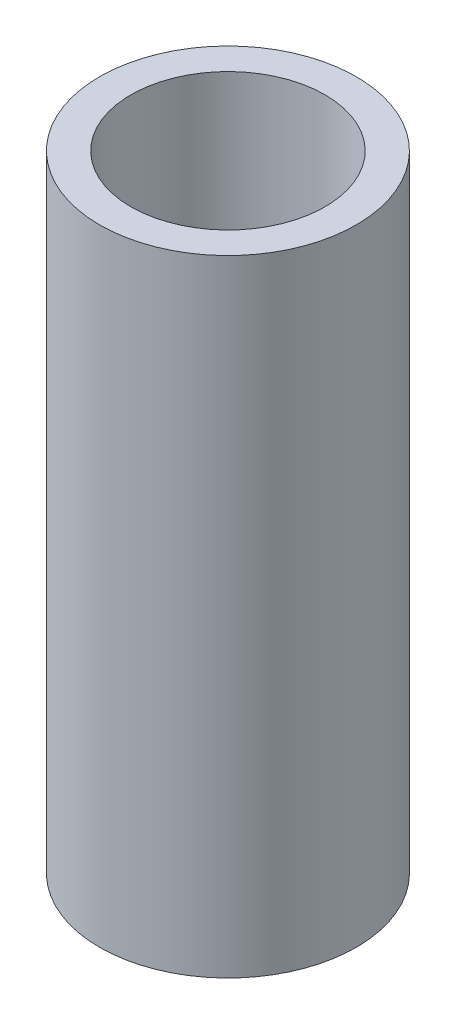
ISO-10303-21;
HEADER;
FILE_DESCRIPTION(('STEP AP214'),'2;1');
FILE_NAME('part.step','',(''),(''),'','','');
FILE_SCHEMA(('AUTOMOTIVE_DESIGN { 1 0 10303 214 1 1 1 1 }'));
ENDSEC;
DATA;
#1=APPLICATION_CONTEXT('core data for automotive mechanical design processes');
#2=APPLICATION_PROTOCOL_DEFINITION('international standard','automotive_design',2000,#1);
#3=PRODUCT_CONTEXT('',#1,'mechanical');
#4=PRODUCT('Part','Part','',(#3));
#5=PRODUCT_RELATED_PRODUCT_CATEGORY('part','',(#4));
#6=PRODUCT_DEFINITION_FORMATION('','',#4);
#7=PRODUCT_DEFINITION_CONTEXT('part definition',#1,'design');
#8=PRODUCT_DEFINITION('design','',#6,#7);
#9=PRODUCT_DEFINITION_SHAPE('','',#8);
#10=(LENGTH_UNIT() NAMED_UNIT(*) SI_UNIT(.MILLI.,.METRE.));
#11=(NAMED_UNIT(*) PLANE_ANGLE_UNIT() SI_UNIT($,.RADIAN.));
#12=(NAMED_UNIT(*) SI_UNIT($,.STERADIAN.) SOLID_ANGLE_UNIT());
#13=UNCERTAINTY_MEASURE_WITH_UNIT(LENGTH_MEASURE(1.E-05),#10,'distance_accuracy_value','');
#14=(GEOMETRIC_REPRESENTATION_CONTEXT(3) GLOBAL_UNCERTAINTY_ASSIGNED_CONTEXT((#13)) GLOBAL_UNIT_ASSIGNED_CONTEXT((#10,
#11,#12)) REPRESENTATION_CONTEXT('',''));
#15=CARTESIAN_POINT('',(0.,0.,0.));
#16=DIRECTION('',(0.,0.,1.));
#17=DIRECTION('',(1.,0.,0.));
#18=AXIS2_PLACEMENT_3D('',#15,#16,#17);
#19=CARTESIAN_POINT('',(0.,19.5,0.));
#20=DIRECTION('',(0.,1.,0.));
#21=DIRECTION('',(0.,0.,1.));
#22=AXIS2_PLACEMENT_3D('',#19,#20,#21);
#23=PLANE('',#22);
#24=CARTESIAN_POINT('',(0.,19.5,0.));
#25=DIRECTION('',(0.,1.,0.));
#26=DIRECTION('',(0.,0.,1.));
#27=AXIS2_PLACEMENT_3D('',#24,#25,#26);
#28=CIRCLE('',#27,4.);
#29=CARTESIAN_POINT('',(0.,19.5,4.));
#30=VERTEX_POINT('',#29);
#31=EDGE_CURVE('E10',#30,#30,#28,.T.);
#32=ORIENTED_EDGE('',*,*,#31,.T.);
#33=EDGE_LOOP('',(#32));
#34=FACE_BOUND('',#33,.T.);
#35=CARTESIAN_POINT('',(0.,19.5,0.));
#36=DIRECTION('',(0.,1.,0.));
#37=DIRECTION('',(0.,0.,1.));
#38=AXIS2_PLACEMENT_3D('',#35,#36,#37);
#39=CIRCLE('',#38,3.025);
#40=CARTESIAN_POINT('',(0.,19.5,3.025));
#41=VERTEX_POINT('',#40);
#42=EDGE_CURVE('E42',#41,#41,#39,.T.);
#43=ORIENTED_EDGE('',*,*,#42,.F.);
#44=EDGE_LOOP('',(#43));
#45=FACE_BOUND('',#44,.T.);
#46=ADVANCED_FACE('F31',(#34,#45),#23,.T.);
#47=CARTESIAN_POINT('',(0.,0.,0.));
#48=DIRECTION('',(0.,1.,0.));
#49=DIRECTION('',(0.,0.,1.));
#50=AXIS2_PLACEMENT_3D('',#47,#48,#49);
#51=PLANE('',#50);
#52=CARTESIAN_POINT('',(0.,0.,0.));
#53=DIRECTION('',(0.,1.,0.));
#54=DIRECTION('',(0.,0.,1.));
#55=AXIS2_PLACEMENT_3D('',#52,#53,#54);
#56=CIRCLE('',#55,4.);
#57=CARTESIAN_POINT('',(0.,0.,4.));
#58=VERTEX_POINT('',#57);
#59=EDGE_CURVE('E35',#58,#58,#56,.T.);
#60=ORIENTED_EDGE('',*,*,#59,.F.);
#61=EDGE_LOOP('',(#60));
#62=FACE_BOUND('',#61,.T.);
#63=CARTESIAN_POINT('',(0.,0.,0.));
#64=DIRECTION('',(0.,1.,0.));
#65=DIRECTION('',(0.,0.,1.));
#66=AXIS2_PLACEMENT_3D('',#63,#64,#65);
#67=CIRCLE('',#66,3.025);
#68=CARTESIAN_POINT('',(0.,0.,3.025));
#69=VERTEX_POINT('',#68);
#70=EDGE_CURVE('E44',#69,#69,#67,.T.);
#71=ORIENTED_EDGE('',*,*,#70,.T.);
#72=EDGE_LOOP('',(#71));
#73=FACE_BOUND('',#72,.T.);
#74=ADVANCED_FACE('F54',(#62,#73),#51,.F.);
#75=CARTESIAN_POINT('',(0.,19.5,0.));
#76=DIRECTION('',(0.,-1.,0.));
#77=DIRECTION('',(0.,0.,-1.));
#78=AXIS2_PLACEMENT_3D('',#75,#76,#77);
#79=CYLINDRICAL_SURFACE('',#78,4.);
#80=ORIENTED_EDGE('',*,*,#31,.F.);
#81=EDGE_LOOP('',(#80));
#82=FACE_BOUND('',#81,.T.);
#83=ORIENTED_EDGE('',*,*,#59,.T.);
#84=EDGE_LOOP('',(#83));
#85=FACE_BOUND('',#84,.T.);
#86=ADVANCED_FACE('F33',(#82,#85),#79,.T.);
#87=CARTESIAN_POINT('',(0.,19.5,0.));
#88=DIRECTION('',(0.,-1.,0.));
#89=DIRECTION('',(0.,0.,-1.));
#90=AXIS2_PLACEMENT_3D('',#87,#88,#89);
#91=CYLINDRICAL_SURFACE('',#90,3.025);
#92=ORIENTED_EDGE('',*,*,#42,.T.);
#93=EDGE_LOOP('',(#92));
#94=FACE_BOUND('',#93,.T.);
#95=ORIENTED_EDGE('',*,*,#70,.F.);
#96=EDGE_LOOP('',(#95));
#97=FACE_BOUND('',#96,.T.);
#98=ADVANCED_FACE('F50',(#94,#97),#91,.F.);
#99=CLOSED_SHELL('',(#46,#74,#86,#98));
#100=MANIFOLD_SOLID_BREP('B2',#99);
#101=ADVANCED_BREP_SHAPE_REPRESENTATION('',(#18,#100),#14);
#102=SHAPE_DEFINITION_REPRESENTATION(#9,#101);
ENDSEC;
END-ISO-10303-21;
